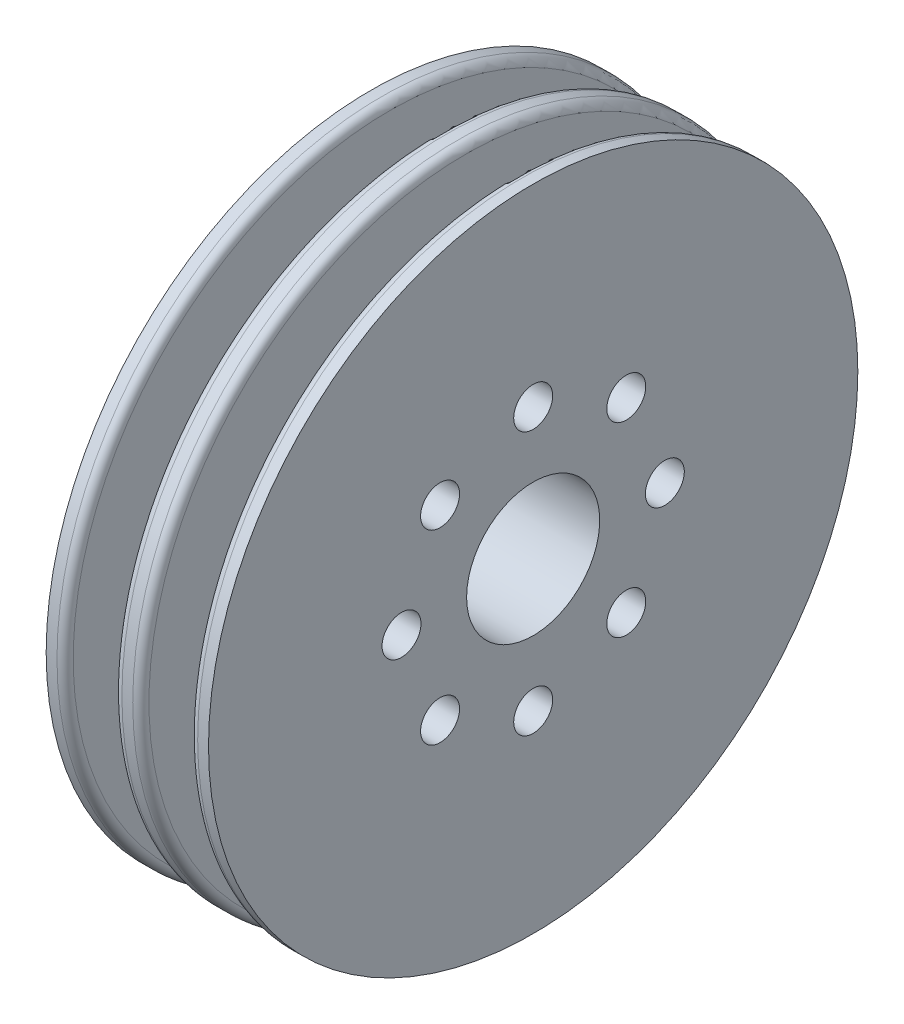
ISO-10303-21;
HEADER;
FILE_DESCRIPTION(('STEP AP214'),'2;1');
FILE_NAME('part.step','',(''),(''),'','','');
FILE_SCHEMA(('AUTOMOTIVE_DESIGN { 1 0 10303 214 1 1 1 1 }'));
ENDSEC;
DATA;
#1=APPLICATION_CONTEXT('core data for automotive mechanical design processes');
#2=APPLICATION_PROTOCOL_DEFINITION('international standard','automotive_design',2000,#1);
#3=PRODUCT_CONTEXT('',#1,'mechanical');
#4=PRODUCT('Part','Part','',(#3));
#5=PRODUCT_RELATED_PRODUCT_CATEGORY('part','',(#4));
#6=PRODUCT_DEFINITION_FORMATION('','',#4);
#7=PRODUCT_DEFINITION_CONTEXT('part definition',#1,'design');
#8=PRODUCT_DEFINITION('design','',#6,#7);
#9=PRODUCT_DEFINITION_SHAPE('','',#8);
#10=(LENGTH_UNIT() NAMED_UNIT(*) SI_UNIT(.MILLI.,.METRE.));
#11=(NAMED_UNIT(*) PLANE_ANGLE_UNIT() SI_UNIT($,.RADIAN.));
#12=(NAMED_UNIT(*) SI_UNIT($,.STERADIAN.) SOLID_ANGLE_UNIT());
#13=UNCERTAINTY_MEASURE_WITH_UNIT(LENGTH_MEASURE(1.E-05),#10,'distance_accuracy_value','');
#14=(GEOMETRIC_REPRESENTATION_CONTEXT(3) GLOBAL_UNCERTAINTY_ASSIGNED_CONTEXT((#13)) GLOBAL_UNIT_ASSIGNED_CONTEXT((#10,
#11,#12)) REPRESENTATION_CONTEXT('',''));
#15=CARTESIAN_POINT('',(0.,0.,0.));
#16=DIRECTION('',(0.,0.,1.));
#17=DIRECTION('',(1.,0.,0.));
#18=AXIS2_PLACEMENT_3D('',#15,#16,#17);
#19=CARTESIAN_POINT('',(0.,0.,20.));
#20=DIRECTION('',(1.,0.,0.));
#21=DIRECTION('',(0.,0.,-1.));
#22=AXIS2_PLACEMENT_3D('',#19,#20,#21);
#23=PLANE('',#22);
#24=CARTESIAN_POINT('',(0.,0.,0.));
#25=DIRECTION('',(-1.,0.,0.));
#26=DIRECTION('',(0.,0.,1.));
#27=AXIS2_PLACEMENT_3D('',#24,#25,#26);
#28=CIRCLE('',#27,4.1);
#29=CARTESIAN_POINT('',(0.,0.,4.1));
#30=VERTEX_POINT('',#29);
#31=EDGE_CURVE('E238',#30,#30,#28,.T.);
#32=ORIENTED_EDGE('',*,*,#31,.F.);
#33=EDGE_LOOP('',(#32));
#34=FACE_BOUND('',#33,.T.);
#35=CARTESIAN_POINT('',(0.,0.,8.11));
#36=DIRECTION('',(-1.,0.,0.));
#37=DIRECTION('',(0.,0.,1.));
#38=AXIS2_PLACEMENT_3D('',#35,#36,#37);
#39=CIRCLE('',#38,2.19999999999999);
#40=CARTESIAN_POINT('',(0.,0.,10.31));
#41=VERTEX_POINT('',#40);
#42=EDGE_CURVE('E233',#41,#41,#39,.T.);
#43=ORIENTED_EDGE('',*,*,#42,.F.);
#44=EDGE_LOOP('',(#43));
#45=FACE_BOUND('',#44,.T.);
#46=CARTESIAN_POINT('',(0.,5.73463599542283,5.73463599542297));
#47=DIRECTION('',(-1.,0.,0.));
#48=DIRECTION('',(0.,0.,1.));
#49=AXIS2_PLACEMENT_3D('',#46,#47,#48);
#50=CIRCLE('',#49,2.19999999999999);
#51=CARTESIAN_POINT('',(0.,5.73463599542283,7.93463599542297));
#52=VERTEX_POINT('',#51);
#53=EDGE_CURVE('E217',#52,#52,#50,.T.);
#54=ORIENTED_EDGE('',*,*,#53,.F.);
#55=EDGE_LOOP('',(#54));
#56=FACE_BOUND('',#55,.T.);
#57=CARTESIAN_POINT('',(0.,8.11,0.));
#58=DIRECTION('',(-1.,0.,0.));
#59=DIRECTION('',(0.,0.,1.));
#60=AXIS2_PLACEMENT_3D('',#57,#58,#59);
#61=CIRCLE('',#60,2.19999999999999);
#62=CARTESIAN_POINT('',(0.,8.11,2.20000000000008));
#63=VERTEX_POINT('',#62);
#64=EDGE_CURVE('E201',#63,#63,#61,.T.);
#65=ORIENTED_EDGE('',*,*,#64,.F.);
#66=EDGE_LOOP('',(#65));
#67=FACE_BOUND('',#66,.T.);
#68=CARTESIAN_POINT('',(0.,5.73463599542295,-5.73463599542285));
#69=DIRECTION('',(-1.,0.,0.));
#70=DIRECTION('',(0.,0.,1.));
#71=AXIS2_PLACEMENT_3D('',#68,#69,#70);
#72=CIRCLE('',#71,2.19999999999999);
#73=CARTESIAN_POINT('',(0.,5.73463599542295,-3.53463599542286));
#74=VERTEX_POINT('',#73);
#75=EDGE_CURVE('E185',#74,#74,#72,.T.);
#76=ORIENTED_EDGE('',*,*,#75,.F.);
#77=EDGE_LOOP('',(#76));
#78=FACE_BOUND('',#77,.T.);
#79=CARTESIAN_POINT('',(0.,0.,-8.11));
#80=DIRECTION('',(-1.,0.,0.));
#81=DIRECTION('',(0.,0.,1.));
#82=AXIS2_PLACEMENT_3D('',#79,#80,#81);
#83=CIRCLE('',#82,2.19999999999999);
#84=CARTESIAN_POINT('',(0.,0.,-5.91000000000001));
#85=VERTEX_POINT('',#84);
#86=EDGE_CURVE('E169',#85,#85,#83,.T.);
#87=ORIENTED_EDGE('',*,*,#86,.F.);
#88=EDGE_LOOP('',(#87));
#89=FACE_BOUND('',#88,.T.);
#90=CARTESIAN_POINT('',(0.,-5.73463599542287,-5.73463599542293));
#91=DIRECTION('',(-1.,0.,0.));
#92=DIRECTION('',(0.,0.,1.));
#93=AXIS2_PLACEMENT_3D('',#90,#91,#92);
#94=CIRCLE('',#93,2.19999999999999);
#95=CARTESIAN_POINT('',(0.,-5.73463599542287,-3.53463599542294));
#96=VERTEX_POINT('',#95);
#97=EDGE_CURVE('E153',#96,#96,#94,.T.);
#98=ORIENTED_EDGE('',*,*,#97,.F.);
#99=EDGE_LOOP('',(#98));
#100=FACE_BOUND('',#99,.T.);
#101=CARTESIAN_POINT('',(0.,-5.73463599542291,5.73463599542289));
#102=DIRECTION('',(-1.,0.,0.));
#103=DIRECTION('',(0.,0.,1.));
#104=AXIS2_PLACEMENT_3D('',#101,#102,#103);
#105=CIRCLE('',#104,2.19999999999999);
#106=CARTESIAN_POINT('',(0.,-5.73463599542291,7.93463599542289));
#107=VERTEX_POINT('',#106);
#108=EDGE_CURVE('E121',#107,#107,#105,.T.);
#109=ORIENTED_EDGE('',*,*,#108,.F.);
#110=EDGE_LOOP('',(#109));
#111=FACE_BOUND('',#110,.T.);
#112=CARTESIAN_POINT('',(0.,0.,0.));
#113=DIRECTION('',(1.,0.,0.));
#114=DIRECTION('',(0.,0.,-1.));
#115=AXIS2_PLACEMENT_3D('',#112,#113,#114);
#116=CIRCLE('',#115,20.);
#117=CARTESIAN_POINT('',(0.,0.,-20.));
#118=VERTEX_POINT('',#117);
#119=EDGE_CURVE('E89',#118,#118,#116,.T.);
#120=ORIENTED_EDGE('',*,*,#119,.F.);
#121=EDGE_LOOP('',(#120));
#122=FACE_BOUND('',#121,.T.);
#123=CARTESIAN_POINT('',(0.,-8.11,0.));
#124=DIRECTION('',(-1.,0.,0.));
#125=DIRECTION('',(0.,0.,1.));
#126=AXIS2_PLACEMENT_3D('',#123,#124,#125);
#127=CIRCLE('',#126,2.19999999999999);
#128=CARTESIAN_POINT('',(0.,-8.11,2.19999999999996));
#129=VERTEX_POINT('',#128);
#130=EDGE_CURVE('E137',#129,#129,#127,.T.);
#131=ORIENTED_EDGE('',*,*,#130,.F.);
#132=EDGE_LOOP('',(#131));
#133=FACE_BOUND('',#132,.T.);
#134=ADVANCED_FACE('F45',(#34,#45,#56,#67,#78,#89,#100,#111,#122,#133),#23,.F.);
#135=CARTESIAN_POINT('',(7.33333333333333,0.,0.));
#136=DIRECTION('',(1.,0.,0.));
#137=DIRECTION('',(0.,0.,-1.));
#138=AXIS2_PLACEMENT_3D('',#135,#136,#137);
#139=TOROIDAL_SURFACE('',#138,15.,1.5);
#140=CARTESIAN_POINT('',(8.83333333333333,0.,0.));
#141=DIRECTION('',(1.,0.,0.));
#142=DIRECTION('',(0.,0.,-1.));
#143=AXIS2_PLACEMENT_3D('',#140,#141,#142);
#144=CIRCLE('',#143,15.);
#145=CARTESIAN_POINT('',(8.83333333333333,0.,-15.));
#146=VERTEX_POINT('',#145);
#147=EDGE_CURVE('E105',#146,#146,#144,.T.);
#148=ORIENTED_EDGE('',*,*,#147,.F.);
#149=EDGE_LOOP('',(#148));
#150=FACE_BOUND('',#149,.T.);
#151=CARTESIAN_POINT('',(5.83333333333333,0.,0.));
#152=DIRECTION('',(1.,0.,0.));
#153=DIRECTION('',(0.,0.,-1.));
#154=AXIS2_PLACEMENT_3D('',#151,#152,#153);
#155=CIRCLE('',#154,15.);
#156=CARTESIAN_POINT('',(5.83333333333333,0.,-15.));
#157=VERTEX_POINT('',#156);
#158=EDGE_CURVE('E10',#157,#157,#155,.T.);
#159=ORIENTED_EDGE('',*,*,#158,.T.);
#160=EDGE_LOOP('',(#159));
#161=FACE_BOUND('',#160,.T.);
#162=ADVANCED_FACE('F47',(#150,#161),#139,.F.);
#163=CARTESIAN_POINT('',(5.83333333333333,0.,19.5));
#164=DIRECTION('',(-1.,0.,0.));
#165=DIRECTION('',(0.,0.,1.));
#166=AXIS2_PLACEMENT_3D('',#163,#164,#165);
#167=PLANE('',#166);
#168=ORIENTED_EDGE('',*,*,#158,.F.);
#169=EDGE_LOOP('',(#168));
#170=FACE_BOUND('',#169,.T.);
#171=CARTESIAN_POINT('',(5.83333333333333,0.,0.));
#172=DIRECTION('',(1.,0.,0.));
#173=DIRECTION('',(0.,0.,-1.));
#174=AXIS2_PLACEMENT_3D('',#171,#172,#173);
#175=CIRCLE('',#174,19.5);
#176=CARTESIAN_POINT('',(5.83333333333333,0.,-19.5));
#177=VERTEX_POINT('',#176);
#178=EDGE_CURVE('E53',#177,#177,#175,.T.);
#179=ORIENTED_EDGE('',*,*,#178,.T.);
#180=EDGE_LOOP('',(#179));
#181=FACE_BOUND('',#180,.T.);
#182=ADVANCED_FACE('F355',(#170,#181),#167,.F.);
#183=CARTESIAN_POINT('',(5.33333333333333,0.,0.));
#184=DIRECTION('',(1.,0.,0.));
#185=DIRECTION('',(0.,0.,-1.));
#186=AXIS2_PLACEMENT_3D('',#183,#184,#185);
#187=TOROIDAL_SURFACE('',#186,19.5,0.5);
#188=ORIENTED_EDGE('',*,*,#178,.F.);
#189=EDGE_LOOP('',(#188));
#190=FACE_BOUND('',#189,.T.);
#191=CARTESIAN_POINT('',(5.33333333333333,0.,0.));
#192=DIRECTION('',(1.,0.,0.));
#193=DIRECTION('',(0.,0.,-1.));
#194=AXIS2_PLACEMENT_3D('',#191,#192,#193);
#195=CIRCLE('',#194,20.);
#196=CARTESIAN_POINT('',(5.33333333333333,0.,-20.));
#197=VERTEX_POINT('',#196);
#198=EDGE_CURVE('E58',#197,#197,#195,.T.);
#199=ORIENTED_EDGE('',*,*,#198,.T.);
#200=EDGE_LOOP('',(#199));
#201=FACE_BOUND('',#200,.T.);
#202=ADVANCED_FACE('F352',(#190,#201),#187,.T.);
#203=CARTESIAN_POINT('',(10.,0.,0.));
#204=DIRECTION('',(1.,0.,0.));
#205=DIRECTION('',(0.,0.,-1.));
#206=AXIS2_PLACEMENT_3D('',#203,#204,#205);
#207=CYLINDRICAL_SURFACE('',#206,20.);
#208=ORIENTED_EDGE('',*,*,#198,.F.);
#209=EDGE_LOOP('',(#208));
#210=FACE_BOUND('',#209,.T.);
#211=CARTESIAN_POINT('',(4.66666666666667,0.,0.));
#212=DIRECTION('',(1.,0.,0.));
#213=DIRECTION('',(0.,0.,-1.));
#214=AXIS2_PLACEMENT_3D('',#211,#212,#213);
#215=CIRCLE('',#214,20.);
#216=CARTESIAN_POINT('',(4.66666666666667,0.,-20.));
#217=VERTEX_POINT('',#216);
#218=EDGE_CURVE('E63',#217,#217,#215,.T.);
#219=ORIENTED_EDGE('',*,*,#218,.T.);
#220=EDGE_LOOP('',(#219));
#221=FACE_BOUND('',#220,.T.);
#222=ADVANCED_FACE('F348',(#210,#221),#207,.T.);
#223=CARTESIAN_POINT('',(4.66666666666667,0.,0.));
#224=DIRECTION('',(1.,0.,0.));
#225=DIRECTION('',(0.,0.,-1.));
#226=AXIS2_PLACEMENT_3D('',#223,#224,#225);
#227=TOROIDAL_SURFACE('',#226,19.5,0.5);
#228=ORIENTED_EDGE('',*,*,#218,.F.);
#229=EDGE_LOOP('',(#228));
#230=FACE_BOUND('',#229,.T.);
#231=CARTESIAN_POINT('',(4.16666666666667,0.,0.));
#232=DIRECTION('',(1.,0.,0.));
#233=DIRECTION('',(0.,0.,-1.));
#234=AXIS2_PLACEMENT_3D('',#231,#232,#233);
#235=CIRCLE('',#234,19.5);
#236=CARTESIAN_POINT('',(4.16666666666667,0.,-19.5));
#237=VERTEX_POINT('',#236);
#238=EDGE_CURVE('E69',#237,#237,#235,.T.);
#239=ORIENTED_EDGE('',*,*,#238,.T.);
#240=EDGE_LOOP('',(#239));
#241=FACE_BOUND('',#240,.T.);
#242=ADVANCED_FACE('F344',(#230,#241),#227,.T.);
#243=CARTESIAN_POINT('',(4.16666666666667,0.,19.5));
#244=DIRECTION('',(1.,0.,0.));
#245=DIRECTION('',(0.,0.,-1.));
#246=AXIS2_PLACEMENT_3D('',#243,#244,#245);
#247=PLANE('',#246);
#248=ORIENTED_EDGE('',*,*,#238,.F.);
#249=EDGE_LOOP('',(#248));
#250=FACE_BOUND('',#249,.T.);
#251=CARTESIAN_POINT('',(4.16666666666667,0.,0.));
#252=DIRECTION('',(1.,0.,0.));
#253=DIRECTION('',(0.,0.,-1.));
#254=AXIS2_PLACEMENT_3D('',#251,#252,#253);
#255=CIRCLE('',#254,15.);
#256=CARTESIAN_POINT('',(4.16666666666667,0.,-15.));
#257=VERTEX_POINT('',#256);
#258=EDGE_CURVE('E73',#257,#257,#255,.T.);
#259=ORIENTED_EDGE('',*,*,#258,.T.);
#260=EDGE_LOOP('',(#259));
#261=FACE_BOUND('',#260,.T.);
#262=ADVANCED_FACE('F340',(#250,#261),#247,.F.);
#263=CARTESIAN_POINT('',(2.66666666666667,0.,0.));
#264=DIRECTION('',(1.,0.,0.));
#265=DIRECTION('',(0.,0.,-1.));
#266=AXIS2_PLACEMENT_3D('',#263,#264,#265);
#267=TOROIDAL_SURFACE('',#266,15.,1.5);
#268=ORIENTED_EDGE('',*,*,#258,.F.);
#269=EDGE_LOOP('',(#268));
#270=FACE_BOUND('',#269,.T.);
#271=CARTESIAN_POINT('',(1.16666666666667,0.,0.));
#272=DIRECTION('',(1.,0.,0.));
#273=DIRECTION('',(0.,0.,-1.));
#274=AXIS2_PLACEMENT_3D('',#271,#272,#273);
#275=CIRCLE('',#274,15.);
#276=CARTESIAN_POINT('',(1.16666666666667,0.,-15.));
#277=VERTEX_POINT('',#276);
#278=EDGE_CURVE('E77',#277,#277,#275,.T.);
#279=ORIENTED_EDGE('',*,*,#278,.T.);
#280=EDGE_LOOP('',(#279));
#281=FACE_BOUND('',#280,.T.);
#282=ADVANCED_FACE('F336',(#270,#281),#267,.F.);
#283=CARTESIAN_POINT('',(1.16666666666667,0.,15.));
#284=DIRECTION('',(-1.,0.,0.));
#285=DIRECTION('',(0.,0.,1.));
#286=AXIS2_PLACEMENT_3D('',#283,#284,#285);
#287=PLANE('',#286);
#288=ORIENTED_EDGE('',*,*,#278,.F.);
#289=EDGE_LOOP('',(#288));
#290=FACE_BOUND('',#289,.T.);
#291=CARTESIAN_POINT('',(1.16666666666667,0.,0.));
#292=DIRECTION('',(1.,0.,0.));
#293=DIRECTION('',(0.,0.,-1.));
#294=AXIS2_PLACEMENT_3D('',#291,#292,#293);
#295=CIRCLE('',#294,19.5);
#296=CARTESIAN_POINT('',(1.16666666666667,0.,-19.5));
#297=VERTEX_POINT('',#296);
#298=EDGE_CURVE('E81',#297,#297,#295,.T.);
#299=ORIENTED_EDGE('',*,*,#298,.T.);
#300=EDGE_LOOP('',(#299));
#301=FACE_BOUND('',#300,.T.);
#302=ADVANCED_FACE('F332',(#290,#301),#287,.F.);
#303=CARTESIAN_POINT('',(0.666666666666666,0.,0.));
#304=DIRECTION('',(1.,0.,0.));
#305=DIRECTION('',(0.,0.,-1.));
#306=AXIS2_PLACEMENT_3D('',#303,#304,#305);
#307=TOROIDAL_SURFACE('',#306,19.5,0.5);
#308=ORIENTED_EDGE('',*,*,#298,.F.);
#309=EDGE_LOOP('',(#308));
#310=FACE_BOUND('',#309,.T.);
#311=CARTESIAN_POINT('',(0.666666666666666,0.,0.));
#312=DIRECTION('',(1.,0.,0.));
#313=DIRECTION('',(0.,0.,-1.));
#314=AXIS2_PLACEMENT_3D('',#311,#312,#313);
#315=CIRCLE('',#314,20.);
#316=CARTESIAN_POINT('',(0.666666666666666,0.,-20.));
#317=VERTEX_POINT('',#316);
#318=EDGE_CURVE('E85',#317,#317,#315,.T.);
#319=ORIENTED_EDGE('',*,*,#318,.T.);
#320=EDGE_LOOP('',(#319));
#321=FACE_BOUND('',#320,.T.);
#322=ADVANCED_FACE('F328',(#310,#321),#307,.T.);
#323=CARTESIAN_POINT('',(10.,0.,0.));
#324=DIRECTION('',(1.,0.,0.));
#325=DIRECTION('',(0.,0.,-1.));
#326=AXIS2_PLACEMENT_3D('',#323,#324,#325);
#327=CYLINDRICAL_SURFACE('',#326,20.);
#328=ORIENTED_EDGE('',*,*,#318,.F.);
#329=EDGE_LOOP('',(#328));
#330=FACE_BOUND('',#329,.T.);
#331=ORIENTED_EDGE('',*,*,#119,.T.);
#332=EDGE_LOOP('',(#331));
#333=FACE_BOUND('',#332,.T.);
#334=ADVANCED_FACE('F324',(#330,#333),#327,.T.);
#335=CARTESIAN_POINT('',(10.,0.,20.));
#336=DIRECTION('',(-1.,0.,0.));
#337=DIRECTION('',(0.,0.,1.));
#338=AXIS2_PLACEMENT_3D('',#335,#336,#337);
#339=PLANE('',#338);
#340=CARTESIAN_POINT('',(10.,0.,0.));
#341=DIRECTION('',(-1.,0.,0.));
#342=DIRECTION('',(0.,0.,1.));
#343=AXIS2_PLACEMENT_3D('',#340,#341,#342);
#344=CIRCLE('',#343,4.1);
#345=CARTESIAN_POINT('',(10.,0.,4.1));
#346=VERTEX_POINT('',#345);
#347=EDGE_CURVE('E237',#346,#346,#344,.T.);
#348=ORIENTED_EDGE('',*,*,#347,.T.);
#349=EDGE_LOOP('',(#348));
#350=FACE_BOUND('',#349,.T.);
#351=CARTESIAN_POINT('',(10.,0.,8.11));
#352=DIRECTION('',(-1.,0.,0.));
#353=DIRECTION('',(0.,0.,1.));
#354=AXIS2_PLACEMENT_3D('',#351,#352,#353);
#355=CIRCLE('',#354,1.2);
#356=CARTESIAN_POINT('',(10.,0.,9.31));
#357=VERTEX_POINT('',#356);
#358=EDGE_CURVE('E221',#357,#357,#355,.T.);
#359=ORIENTED_EDGE('',*,*,#358,.T.);
#360=EDGE_LOOP('',(#359));
#361=FACE_BOUND('',#360,.T.);
#362=CARTESIAN_POINT('',(10.,5.73463599542283,5.73463599542297));
#363=DIRECTION('',(-1.,0.,0.));
#364=DIRECTION('',(0.,0.,1.));
#365=AXIS2_PLACEMENT_3D('',#362,#363,#364);
#366=CIRCLE('',#365,1.2);
#367=CARTESIAN_POINT('',(10.,5.73463599542283,6.93463599542297));
#368=VERTEX_POINT('',#367);
#369=EDGE_CURVE('E205',#368,#368,#366,.T.);
#370=ORIENTED_EDGE('',*,*,#369,.T.);
#371=EDGE_LOOP('',(#370));
#372=FACE_BOUND('',#371,.T.);
#373=CARTESIAN_POINT('',(10.,8.11,0.));
#374=DIRECTION('',(-1.,0.,0.));
#375=DIRECTION('',(0.,0.,1.));
#376=AXIS2_PLACEMENT_3D('',#373,#374,#375);
#377=CIRCLE('',#376,1.2);
#378=CARTESIAN_POINT('',(10.,8.11,1.20000000000008));
#379=VERTEX_POINT('',#378);
#380=EDGE_CURVE('E189',#379,#379,#377,.T.);
#381=ORIENTED_EDGE('',*,*,#380,.T.);
#382=EDGE_LOOP('',(#381));
#383=FACE_BOUND('',#382,.T.);
#384=CARTESIAN_POINT('',(10.,5.73463599542295,-5.73463599542285));
#385=DIRECTION('',(-1.,0.,0.));
#386=DIRECTION('',(0.,0.,1.));
#387=AXIS2_PLACEMENT_3D('',#384,#385,#386);
#388=CIRCLE('',#387,1.2);
#389=CARTESIAN_POINT('',(10.,5.73463599542295,-4.53463599542285));
#390=VERTEX_POINT('',#389);
#391=EDGE_CURVE('E173',#390,#390,#388,.T.);
#392=ORIENTED_EDGE('',*,*,#391,.T.);
#393=EDGE_LOOP('',(#392));
#394=FACE_BOUND('',#393,.T.);
#395=CARTESIAN_POINT('',(10.,0.,-8.11));
#396=DIRECTION('',(-1.,0.,0.));
#397=DIRECTION('',(0.,0.,1.));
#398=AXIS2_PLACEMENT_3D('',#395,#396,#397);
#399=CIRCLE('',#398,1.2);
#400=CARTESIAN_POINT('',(10.,0.,-6.91000000000001));
#401=VERTEX_POINT('',#400);
#402=EDGE_CURVE('E157',#401,#401,#399,.T.);
#403=ORIENTED_EDGE('',*,*,#402,.T.);
#404=EDGE_LOOP('',(#403));
#405=FACE_BOUND('',#404,.T.);
#406=CARTESIAN_POINT('',(10.,-5.73463599542287,-5.73463599542293));
#407=DIRECTION('',(-1.,0.,0.));
#408=DIRECTION('',(0.,0.,1.));
#409=AXIS2_PLACEMENT_3D('',#406,#407,#408);
#410=CIRCLE('',#409,1.2);
#411=CARTESIAN_POINT('',(10.,-5.73463599542287,-4.53463599542293));
#412=VERTEX_POINT('',#411);
#413=EDGE_CURVE('E141',#412,#412,#410,.T.);
#414=ORIENTED_EDGE('',*,*,#413,.T.);
#415=EDGE_LOOP('',(#414));
#416=FACE_BOUND('',#415,.T.);
#417=CARTESIAN_POINT('',(10.,-8.11,0.));
#418=DIRECTION('',(-1.,0.,0.));
#419=DIRECTION('',(0.,0.,1.));
#420=AXIS2_PLACEMENT_3D('',#417,#418,#419);
#421=CIRCLE('',#420,1.2);
#422=CARTESIAN_POINT('',(10.,-8.11,1.19999999999997));
#423=VERTEX_POINT('',#422);
#424=EDGE_CURVE('E125',#423,#423,#421,.T.);
#425=ORIENTED_EDGE('',*,*,#424,.T.);
#426=EDGE_LOOP('',(#425));
#427=FACE_BOUND('',#426,.T.);
#428=CARTESIAN_POINT('',(10.,-5.73463599542291,5.73463599542289));
#429=DIRECTION('',(-1.,0.,0.));
#430=DIRECTION('',(0.,0.,1.));
#431=AXIS2_PLACEMENT_3D('',#428,#429,#430);
#432=CIRCLE('',#431,1.2);
#433=CARTESIAN_POINT('',(10.,-5.73463599542291,6.93463599542289));
#434=VERTEX_POINT('',#433);
#435=EDGE_CURVE('E109',#434,#434,#432,.T.);
#436=ORIENTED_EDGE('',*,*,#435,.T.);
#437=EDGE_LOOP('',(#436));
#438=FACE_BOUND('',#437,.T.);
#439=CARTESIAN_POINT('',(10.,0.,0.));
#440=DIRECTION('',(1.,0.,0.));
#441=DIRECTION('',(0.,0.,-1.));
#442=AXIS2_PLACEMENT_3D('',#439,#440,#441);
#443=CIRCLE('',#442,20.);
#444=CARTESIAN_POINT('',(10.,0.,-20.));
#445=VERTEX_POINT('',#444);
#446=EDGE_CURVE('E93',#445,#445,#443,.T.);
#447=ORIENTED_EDGE('',*,*,#446,.T.);
#448=EDGE_LOOP('',(#447));
#449=FACE_BOUND('',#448,.T.);
#450=ADVANCED_FACE('F246',(#350,#361,#372,#383,#394,#405,#416,#427,#438,#449),#339,.F.);
#451=CARTESIAN_POINT('',(10.,0.,0.));
#452=DIRECTION('',(1.,0.,0.));
#453=DIRECTION('',(0.,0.,-1.));
#454=AXIS2_PLACEMENT_3D('',#451,#452,#453);
#455=CYLINDRICAL_SURFACE('',#454,20.);
#456=ORIENTED_EDGE('',*,*,#446,.F.);
#457=EDGE_LOOP('',(#456));
#458=FACE_BOUND('',#457,.T.);
#459=CARTESIAN_POINT('',(9.33333333333333,0.,0.));
#460=DIRECTION('',(1.,0.,0.));
#461=DIRECTION('',(0.,0.,-1.));
#462=AXIS2_PLACEMENT_3D('',#459,#460,#461);
#463=CIRCLE('',#462,20.);
#464=CARTESIAN_POINT('',(9.33333333333333,0.,-20.));
#465=VERTEX_POINT('',#464);
#466=EDGE_CURVE('E97',#465,#465,#463,.T.);
#467=ORIENTED_EDGE('',*,*,#466,.T.);
#468=EDGE_LOOP('',(#467));
#469=FACE_BOUND('',#468,.T.);
#470=ADVANCED_FACE('F318',(#458,#469),#455,.T.);
#471=CARTESIAN_POINT('',(9.33333333333333,0.,0.));
#472=DIRECTION('',(1.,0.,0.));
#473=DIRECTION('',(0.,0.,-1.));
#474=AXIS2_PLACEMENT_3D('',#471,#472,#473);
#475=TOROIDAL_SURFACE('',#474,19.5,0.5);
#476=ORIENTED_EDGE('',*,*,#466,.F.);
#477=EDGE_LOOP('',(#476));
#478=FACE_BOUND('',#477,.T.);
#479=CARTESIAN_POINT('',(8.83333333333333,0.,0.));
#480=DIRECTION('',(1.,0.,0.));
#481=DIRECTION('',(0.,0.,-1.));
#482=AXIS2_PLACEMENT_3D('',#479,#480,#481);
#483=CIRCLE('',#482,19.5);
#484=CARTESIAN_POINT('',(8.83333333333333,0.,-19.5));
#485=VERTEX_POINT('',#484);
#486=EDGE_CURVE('E101',#485,#485,#483,.T.);
#487=ORIENTED_EDGE('',*,*,#486,.T.);
#488=EDGE_LOOP('',(#487));
#489=FACE_BOUND('',#488,.T.);
#490=ADVANCED_FACE('F314',(#478,#489),#475,.T.);
#491=CARTESIAN_POINT('',(8.83333333333333,0.,15.));
#492=DIRECTION('',(1.,0.,0.));
#493=DIRECTION('',(0.,0.,-1.));
#494=AXIS2_PLACEMENT_3D('',#491,#492,#493);
#495=PLANE('',#494);
#496=ORIENTED_EDGE('',*,*,#486,.F.);
#497=EDGE_LOOP('',(#496));
#498=FACE_BOUND('',#497,.T.);
#499=ORIENTED_EDGE('',*,*,#147,.T.);
#500=EDGE_LOOP('',(#499));
#501=FACE_BOUND('',#500,.T.);
#502=ADVANCED_FACE('F310',(#498,#501),#495,.F.);
#503=CARTESIAN_POINT('',(0.,-5.73463599542291,5.73463599542289));
#504=DIRECTION('',(-1.,0.,0.));
#505=DIRECTION('',(0.,0.,1.));
#506=AXIS2_PLACEMENT_3D('',#503,#504,#505);
#507=CYLINDRICAL_SURFACE('',#506,1.2);
#508=ORIENTED_EDGE('',*,*,#435,.F.);
#509=EDGE_LOOP('',(#508));
#510=FACE_BOUND('',#509,.T.);
#511=CARTESIAN_POINT('',(2.4,-5.73463599542291,5.73463599542289));
#512=DIRECTION('',(-1.,0.,0.));
#513=DIRECTION('',(0.,0.,1.));
#514=AXIS2_PLACEMENT_3D('',#511,#512,#513);
#515=CIRCLE('',#514,1.2);
#516=CARTESIAN_POINT('',(2.4,-5.73463599542291,6.93463599542289));
#517=VERTEX_POINT('',#516);
#518=EDGE_CURVE('E113',#517,#517,#515,.T.);
#519=ORIENTED_EDGE('',*,*,#518,.T.);
#520=EDGE_LOOP('',(#519));
#521=FACE_BOUND('',#520,.T.);
#522=ADVANCED_FACE('F306',(#510,#521),#507,.F.);
#523=CARTESIAN_POINT('',(2.4,-4.53463599542291,5.73463599542289));
#524=DIRECTION('',(1.,0.,0.));
#525=DIRECTION('',(0.,0.,-1.));
#526=AXIS2_PLACEMENT_3D('',#523,#524,#525);
#527=PLANE('',#526);
#528=ORIENTED_EDGE('',*,*,#518,.F.);
#529=EDGE_LOOP('',(#528));
#530=FACE_BOUND('',#529,.T.);
#531=CARTESIAN_POINT('',(2.4,-5.73463599542291,5.73463599542289));
#532=DIRECTION('',(-1.,0.,0.));
#533=DIRECTION('',(0.,0.,1.));
#534=AXIS2_PLACEMENT_3D('',#531,#532,#533);
#535=CIRCLE('',#534,2.2);
#536=CARTESIAN_POINT('',(2.4,-5.73463599542291,7.93463599542289));
#537=VERTEX_POINT('',#536);
#538=EDGE_CURVE('E117',#537,#537,#535,.T.);
#539=ORIENTED_EDGE('',*,*,#538,.T.);
#540=EDGE_LOOP('',(#539));
#541=FACE_BOUND('',#540,.T.);
#542=ADVANCED_FACE('F302',(#530,#541),#527,.F.);
#543=CARTESIAN_POINT('',(0.,-5.73463599542291,5.73463599542289));
#544=DIRECTION('',(-1.,0.,0.));
#545=DIRECTION('',(0.,0.,1.));
#546=AXIS2_PLACEMENT_3D('',#543,#544,#545);
#547=CYLINDRICAL_SURFACE('',#546,2.2);
#548=ORIENTED_EDGE('',*,*,#538,.F.);
#549=EDGE_LOOP('',(#548));
#550=FACE_BOUND('',#549,.T.);
#551=ORIENTED_EDGE('',*,*,#108,.T.);
#552=EDGE_LOOP('',(#551));
#553=FACE_BOUND('',#552,.T.);
#554=ADVANCED_FACE('F298',(#550,#553),#547,.F.);
#555=CARTESIAN_POINT('',(0.,-8.11,0.));
#556=DIRECTION('',(-1.,0.,0.));
#557=DIRECTION('',(0.,0.,1.));
#558=AXIS2_PLACEMENT_3D('',#555,#556,#557);
#559=CYLINDRICAL_SURFACE('',#558,1.2);
#560=ORIENTED_EDGE('',*,*,#424,.F.);
#561=EDGE_LOOP('',(#560));
#562=FACE_BOUND('',#561,.T.);
#563=CARTESIAN_POINT('',(2.4,-8.11,0.));
#564=DIRECTION('',(-1.,0.,0.));
#565=DIRECTION('',(0.,0.,1.));
#566=AXIS2_PLACEMENT_3D('',#563,#564,#565);
#567=CIRCLE('',#566,1.2);
#568=CARTESIAN_POINT('',(2.4,-8.11,1.19999999999997));
#569=VERTEX_POINT('',#568);
#570=EDGE_CURVE('E129',#569,#569,#567,.T.);
#571=ORIENTED_EDGE('',*,*,#570,.T.);
#572=EDGE_LOOP('',(#571));
#573=FACE_BOUND('',#572,.T.);
#574=ADVANCED_FACE('F290',(#562,#573),#559,.F.);
#575=CARTESIAN_POINT('',(2.4,-6.91,0.));
#576=DIRECTION('',(1.,0.,0.));
#577=DIRECTION('',(0.,0.,-1.));
#578=AXIS2_PLACEMENT_3D('',#575,#576,#577);
#579=PLANE('',#578);
#580=ORIENTED_EDGE('',*,*,#570,.F.);
#581=EDGE_LOOP('',(#580));
#582=FACE_BOUND('',#581,.T.);
#583=CARTESIAN_POINT('',(2.4,-8.11,0.));
#584=DIRECTION('',(-1.,0.,0.));
#585=DIRECTION('',(0.,0.,1.));
#586=AXIS2_PLACEMENT_3D('',#583,#584,#585);
#587=CIRCLE('',#586,2.2);
#588=CARTESIAN_POINT('',(2.4,-8.11,2.19999999999997));
#589=VERTEX_POINT('',#588);
#590=EDGE_CURVE('E133',#589,#589,#587,.T.);
#591=ORIENTED_EDGE('',*,*,#590,.T.);
#592=EDGE_LOOP('',(#591));
#593=FACE_BOUND('',#592,.T.);
#594=ADVANCED_FACE('F280',(#582,#593),#579,.F.);
#595=CARTESIAN_POINT('',(0.,-8.11,0.));
#596=DIRECTION('',(-1.,0.,0.));
#597=DIRECTION('',(0.,0.,1.));
#598=AXIS2_PLACEMENT_3D('',#595,#596,#597);
#599=CYLINDRICAL_SURFACE('',#598,2.2);
#600=ORIENTED_EDGE('',*,*,#590,.F.);
#601=EDGE_LOOP('',(#600));
#602=FACE_BOUND('',#601,.T.);
#603=ORIENTED_EDGE('',*,*,#130,.T.);
#604=EDGE_LOOP('',(#603));
#605=FACE_BOUND('',#604,.T.);
#606=ADVANCED_FACE('F277',(#602,#605),#599,.F.);
#607=CARTESIAN_POINT('',(0.,-5.73463599542287,-5.73463599542293));
#608=DIRECTION('',(-1.,0.,0.));
#609=DIRECTION('',(0.,0.,1.));
#610=AXIS2_PLACEMENT_3D('',#607,#608,#609);
#611=CYLINDRICAL_SURFACE('',#610,1.2);
#612=ORIENTED_EDGE('',*,*,#413,.F.);
#613=EDGE_LOOP('',(#612));
#614=FACE_BOUND('',#613,.T.);
#615=CARTESIAN_POINT('',(2.4,-5.73463599542287,-5.73463599542293));
#616=DIRECTION('',(-1.,0.,0.));
#617=DIRECTION('',(0.,0.,1.));
#618=AXIS2_PLACEMENT_3D('',#615,#616,#617);
#619=CIRCLE('',#618,1.2);
#620=CARTESIAN_POINT('',(2.4,-5.73463599542287,-4.53463599542293));
#621=VERTEX_POINT('',#620);
#622=EDGE_CURVE('E145',#621,#621,#619,.T.);
#623=ORIENTED_EDGE('',*,*,#622,.T.);
#624=EDGE_LOOP('',(#623));
#625=FACE_BOUND('',#624,.T.);
#626=ADVANCED_FACE('F279',(#614,#625),#611,.F.);
#627=CARTESIAN_POINT('',(2.4,-4.53463599542287,-5.73463599542293));
#628=DIRECTION('',(1.,0.,0.));
#629=DIRECTION('',(0.,0.,-1.));
#630=AXIS2_PLACEMENT_3D('',#627,#628,#629);
#631=PLANE('',#630);
#632=ORIENTED_EDGE('',*,*,#622,.F.);
#633=EDGE_LOOP('',(#632));
#634=FACE_BOUND('',#633,.T.);
#635=CARTESIAN_POINT('',(2.4,-5.73463599542287,-5.73463599542293));
#636=DIRECTION('',(-1.,0.,0.));
#637=DIRECTION('',(0.,0.,1.));
#638=AXIS2_PLACEMENT_3D('',#635,#636,#637);
#639=CIRCLE('',#638,2.2);
#640=CARTESIAN_POINT('',(2.4,-5.73463599542287,-3.53463599542293));
#641=VERTEX_POINT('',#640);
#642=EDGE_CURVE('E149',#641,#641,#639,.T.);
#643=ORIENTED_EDGE('',*,*,#642,.T.);
#644=EDGE_LOOP('',(#643));
#645=FACE_BOUND('',#644,.T.);
#646=ADVANCED_FACE('F287',(#634,#645),#631,.F.);
#647=CARTESIAN_POINT('',(0.,-5.73463599542287,-5.73463599542293));
#648=DIRECTION('',(-1.,0.,0.));
#649=DIRECTION('',(0.,0.,1.));
#650=AXIS2_PLACEMENT_3D('',#647,#648,#649);
#651=CYLINDRICAL_SURFACE('',#650,2.2);
#652=ORIENTED_EDGE('',*,*,#642,.F.);
#653=EDGE_LOOP('',(#652));
#654=FACE_BOUND('',#653,.T.);
#655=ORIENTED_EDGE('',*,*,#97,.T.);
#656=EDGE_LOOP('',(#655));
#657=FACE_BOUND('',#656,.T.);
#658=ADVANCED_FACE('F498',(#654,#657),#651,.F.);
#659=CARTESIAN_POINT('',(0.,0.,-8.11));
#660=DIRECTION('',(-1.,0.,0.));
#661=DIRECTION('',(0.,0.,1.));
#662=AXIS2_PLACEMENT_3D('',#659,#660,#661);
#663=CYLINDRICAL_SURFACE('',#662,1.2);
#664=ORIENTED_EDGE('',*,*,#402,.F.);
#665=EDGE_LOOP('',(#664));
#666=FACE_BOUND('',#665,.T.);
#667=CARTESIAN_POINT('',(2.4,0.,-8.11));
#668=DIRECTION('',(-1.,0.,0.));
#669=DIRECTION('',(0.,0.,1.));
#670=AXIS2_PLACEMENT_3D('',#667,#668,#669);
#671=CIRCLE('',#670,1.2);
#672=CARTESIAN_POINT('',(2.4,0.,-6.91));
#673=VERTEX_POINT('',#672);
#674=EDGE_CURVE('E161',#673,#673,#671,.T.);
#675=ORIENTED_EDGE('',*,*,#674,.T.);
#676=EDGE_LOOP('',(#675));
#677=FACE_BOUND('',#676,.T.);
#678=ADVANCED_FACE('F507',(#666,#677),#663,.F.);
#679=CARTESIAN_POINT('',(2.4,1.2,-8.11));
#680=DIRECTION('',(1.,0.,0.));
#681=DIRECTION('',(0.,0.,-1.));
#682=AXIS2_PLACEMENT_3D('',#679,#680,#681);
#683=PLANE('',#682);
#684=ORIENTED_EDGE('',*,*,#674,.F.);
#685=EDGE_LOOP('',(#684));
#686=FACE_BOUND('',#685,.T.);
#687=CARTESIAN_POINT('',(2.4,0.,-8.11));
#688=DIRECTION('',(-1.,0.,0.));
#689=DIRECTION('',(0.,0.,1.));
#690=AXIS2_PLACEMENT_3D('',#687,#688,#689);
#691=CIRCLE('',#690,2.2);
#692=CARTESIAN_POINT('',(2.4,0.,-5.91));
#693=VERTEX_POINT('',#692);
#694=EDGE_CURVE('E165',#693,#693,#691,.T.);
#695=ORIENTED_EDGE('',*,*,#694,.T.);
#696=EDGE_LOOP('',(#695));
#697=FACE_BOUND('',#696,.T.);
#698=ADVANCED_FACE('F517',(#686,#697),#683,.F.);
#699=CARTESIAN_POINT('',(0.,0.,-8.11));
#700=DIRECTION('',(-1.,0.,0.));
#701=DIRECTION('',(0.,0.,1.));
#702=AXIS2_PLACEMENT_3D('',#699,#700,#701);
#703=CYLINDRICAL_SURFACE('',#702,2.2);
#704=ORIENTED_EDGE('',*,*,#694,.F.);
#705=EDGE_LOOP('',(#704));
#706=FACE_BOUND('',#705,.T.);
#707=ORIENTED_EDGE('',*,*,#86,.T.);
#708=EDGE_LOOP('',(#707));
#709=FACE_BOUND('',#708,.T.);
#710=ADVANCED_FACE('F527',(#706,#709),#703,.F.);
#711=CARTESIAN_POINT('',(0.,5.73463599542295,-5.73463599542285));
#712=DIRECTION('',(-1.,0.,0.));
#713=DIRECTION('',(0.,0.,1.));
#714=AXIS2_PLACEMENT_3D('',#711,#712,#713);
#715=CYLINDRICAL_SURFACE('',#714,1.2);
#716=ORIENTED_EDGE('',*,*,#391,.F.);
#717=EDGE_LOOP('',(#716));
#718=FACE_BOUND('',#717,.T.);
#719=CARTESIAN_POINT('',(2.4,5.73463599542295,-5.73463599542285));
#720=DIRECTION('',(-1.,0.,0.));
#721=DIRECTION('',(0.,0.,1.));
#722=AXIS2_PLACEMENT_3D('',#719,#720,#721);
#723=CIRCLE('',#722,1.2);
#724=CARTESIAN_POINT('',(2.4,5.73463599542295,-4.53463599542285));
#725=VERTEX_POINT('',#724);
#726=EDGE_CURVE('E177',#725,#725,#723,.T.);
#727=ORIENTED_EDGE('',*,*,#726,.T.);
#728=EDGE_LOOP('',(#727));
#729=FACE_BOUND('',#728,.T.);
#730=ADVANCED_FACE('F537',(#718,#729),#715,.F.);
#731=CARTESIAN_POINT('',(2.4,6.93463599542295,-5.73463599542285));
#732=DIRECTION('',(1.,0.,0.));
#733=DIRECTION('',(0.,0.,-1.));
#734=AXIS2_PLACEMENT_3D('',#731,#732,#733);
#735=PLANE('',#734);
#736=ORIENTED_EDGE('',*,*,#726,.F.);
#737=EDGE_LOOP('',(#736));
#738=FACE_BOUND('',#737,.T.);
#739=CARTESIAN_POINT('',(2.4,5.73463599542295,-5.73463599542285));
#740=DIRECTION('',(-1.,0.,0.));
#741=DIRECTION('',(0.,0.,1.));
#742=AXIS2_PLACEMENT_3D('',#739,#740,#741);
#743=CIRCLE('',#742,2.2);
#744=CARTESIAN_POINT('',(2.4,5.73463599542295,-3.53463599542285));
#745=VERTEX_POINT('',#744);
#746=EDGE_CURVE('E181',#745,#745,#743,.T.);
#747=ORIENTED_EDGE('',*,*,#746,.T.);
#748=EDGE_LOOP('',(#747));
#749=FACE_BOUND('',#748,.T.);
#750=ADVANCED_FACE('F547',(#738,#749),#735,.F.);
#751=CARTESIAN_POINT('',(0.,5.73463599542295,-5.73463599542285));
#752=DIRECTION('',(-1.,0.,0.));
#753=DIRECTION('',(0.,0.,1.));
#754=AXIS2_PLACEMENT_3D('',#751,#752,#753);
#755=CYLINDRICAL_SURFACE('',#754,2.2);
#756=ORIENTED_EDGE('',*,*,#746,.F.);
#757=EDGE_LOOP('',(#756));
#758=FACE_BOUND('',#757,.T.);
#759=ORIENTED_EDGE('',*,*,#75,.T.);
#760=EDGE_LOOP('',(#759));
#761=FACE_BOUND('',#760,.T.);
#762=ADVANCED_FACE('F557',(#758,#761),#755,.F.);
#763=CARTESIAN_POINT('',(0.,8.11,0.));
#764=DIRECTION('',(-1.,0.,0.));
#765=DIRECTION('',(0.,0.,1.));
#766=AXIS2_PLACEMENT_3D('',#763,#764,#765);
#767=CYLINDRICAL_SURFACE('',#766,1.2);
#768=ORIENTED_EDGE('',*,*,#380,.F.);
#769=EDGE_LOOP('',(#768));
#770=FACE_BOUND('',#769,.T.);
#771=CARTESIAN_POINT('',(2.4,8.11,0.));
#772=DIRECTION('',(-1.,0.,0.));
#773=DIRECTION('',(0.,0.,1.));
#774=AXIS2_PLACEMENT_3D('',#771,#772,#773);
#775=CIRCLE('',#774,1.2);
#776=CARTESIAN_POINT('',(2.4,8.11,1.20000000000009));
#777=VERTEX_POINT('',#776);
#778=EDGE_CURVE('E193',#777,#777,#775,.T.);
#779=ORIENTED_EDGE('',*,*,#778,.T.);
#780=EDGE_LOOP('',(#779));
#781=FACE_BOUND('',#780,.T.);
#782=ADVANCED_FACE('F567',(#770,#781),#767,.F.);
#783=CARTESIAN_POINT('',(2.4,9.31,0.));
#784=DIRECTION('',(1.,0.,0.));
#785=DIRECTION('',(0.,0.,-1.));
#786=AXIS2_PLACEMENT_3D('',#783,#784,#785);
#787=PLANE('',#786);
#788=ORIENTED_EDGE('',*,*,#778,.F.);
#789=EDGE_LOOP('',(#788));
#790=FACE_BOUND('',#789,.T.);
#791=CARTESIAN_POINT('',(2.4,8.11,0.));
#792=DIRECTION('',(-1.,0.,0.));
#793=DIRECTION('',(0.,0.,1.));
#794=AXIS2_PLACEMENT_3D('',#791,#792,#793);
#795=CIRCLE('',#794,2.2);
#796=CARTESIAN_POINT('',(2.4,8.11,2.20000000000008));
#797=VERTEX_POINT('',#796);
#798=EDGE_CURVE('E197',#797,#797,#795,.T.);
#799=ORIENTED_EDGE('',*,*,#798,.T.);
#800=EDGE_LOOP('',(#799));
#801=FACE_BOUND('',#800,.T.);
#802=ADVANCED_FACE('F577',(#790,#801),#787,.F.);
#803=CARTESIAN_POINT('',(0.,8.11,0.));
#804=DIRECTION('',(-1.,0.,0.));
#805=DIRECTION('',(0.,0.,1.));
#806=AXIS2_PLACEMENT_3D('',#803,#804,#805);
#807=CYLINDRICAL_SURFACE('',#806,2.2);
#808=ORIENTED_EDGE('',*,*,#798,.F.);
#809=EDGE_LOOP('',(#808));
#810=FACE_BOUND('',#809,.T.);
#811=ORIENTED_EDGE('',*,*,#64,.T.);
#812=EDGE_LOOP('',(#811));
#813=FACE_BOUND('',#812,.T.);
#814=ADVANCED_FACE('F587',(#810,#813),#807,.F.);
#815=CARTESIAN_POINT('',(0.,5.73463599542283,5.73463599542297));
#816=DIRECTION('',(-1.,0.,0.));
#817=DIRECTION('',(0.,0.,1.));
#818=AXIS2_PLACEMENT_3D('',#815,#816,#817);
#819=CYLINDRICAL_SURFACE('',#818,1.2);
#820=ORIENTED_EDGE('',*,*,#369,.F.);
#821=EDGE_LOOP('',(#820));
#822=FACE_BOUND('',#821,.T.);
#823=CARTESIAN_POINT('',(2.4,5.73463599542283,5.73463599542297));
#824=DIRECTION('',(-1.,0.,0.));
#825=DIRECTION('',(0.,0.,1.));
#826=AXIS2_PLACEMENT_3D('',#823,#824,#825);
#827=CIRCLE('',#826,1.2);
#828=CARTESIAN_POINT('',(2.4,5.73463599542283,6.93463599542297));
#829=VERTEX_POINT('',#828);
#830=EDGE_CURVE('E209',#829,#829,#827,.T.);
#831=ORIENTED_EDGE('',*,*,#830,.T.);
#832=EDGE_LOOP('',(#831));
#833=FACE_BOUND('',#832,.T.);
#834=ADVANCED_FACE('F597',(#822,#833),#819,.F.);
#835=CARTESIAN_POINT('',(2.4,6.93463599542283,5.73463599542297));
#836=DIRECTION('',(1.,0.,0.));
#837=DIRECTION('',(0.,0.,-1.));
#838=AXIS2_PLACEMENT_3D('',#835,#836,#837);
#839=PLANE('',#838);
#840=ORIENTED_EDGE('',*,*,#830,.F.);
#841=EDGE_LOOP('',(#840));
#842=FACE_BOUND('',#841,.T.);
#843=CARTESIAN_POINT('',(2.4,5.73463599542283,5.73463599542297));
#844=DIRECTION('',(-1.,0.,0.));
#845=DIRECTION('',(0.,0.,1.));
#846=AXIS2_PLACEMENT_3D('',#843,#844,#845);
#847=CIRCLE('',#846,2.2);
#848=CARTESIAN_POINT('',(2.4,5.73463599542283,7.93463599542297));
#849=VERTEX_POINT('',#848);
#850=EDGE_CURVE('E213',#849,#849,#847,.T.);
#851=ORIENTED_EDGE('',*,*,#850,.T.);
#852=EDGE_LOOP('',(#851));
#853=FACE_BOUND('',#852,.T.);
#854=ADVANCED_FACE('F607',(#842,#853),#839,.F.);
#855=CARTESIAN_POINT('',(0.,5.73463599542283,5.73463599542297));
#856=DIRECTION('',(-1.,0.,0.));
#857=DIRECTION('',(0.,0.,1.));
#858=AXIS2_PLACEMENT_3D('',#855,#856,#857);
#859=CYLINDRICAL_SURFACE('',#858,2.2);
#860=ORIENTED_EDGE('',*,*,#850,.F.);
#861=EDGE_LOOP('',(#860));
#862=FACE_BOUND('',#861,.T.);
#863=ORIENTED_EDGE('',*,*,#53,.T.);
#864=EDGE_LOOP('',(#863));
#865=FACE_BOUND('',#864,.T.);
#866=ADVANCED_FACE('F617',(#862,#865),#859,.F.);
#867=CARTESIAN_POINT('',(0.,0.,8.11));
#868=DIRECTION('',(-1.,0.,0.));
#869=DIRECTION('',(0.,0.,1.));
#870=AXIS2_PLACEMENT_3D('',#867,#868,#869);
#871=CYLINDRICAL_SURFACE('',#870,1.2);
#872=ORIENTED_EDGE('',*,*,#358,.F.);
#873=EDGE_LOOP('',(#872));
#874=FACE_BOUND('',#873,.T.);
#875=CARTESIAN_POINT('',(2.4,0.,8.11));
#876=DIRECTION('',(-1.,0.,0.));
#877=DIRECTION('',(0.,0.,1.));
#878=AXIS2_PLACEMENT_3D('',#875,#876,#877);
#879=CIRCLE('',#878,1.2);
#880=CARTESIAN_POINT('',(2.4,0.,9.31));
#881=VERTEX_POINT('',#880);
#882=EDGE_CURVE('E225',#881,#881,#879,.T.);
#883=ORIENTED_EDGE('',*,*,#882,.T.);
#884=EDGE_LOOP('',(#883));
#885=FACE_BOUND('',#884,.T.);
#886=ADVANCED_FACE('F627',(#874,#885),#871,.F.);
#887=CARTESIAN_POINT('',(2.4,1.2,8.11));
#888=DIRECTION('',(1.,0.,0.));
#889=DIRECTION('',(0.,0.,-1.));
#890=AXIS2_PLACEMENT_3D('',#887,#888,#889);
#891=PLANE('',#890);
#892=ORIENTED_EDGE('',*,*,#882,.F.);
#893=EDGE_LOOP('',(#892));
#894=FACE_BOUND('',#893,.T.);
#895=CARTESIAN_POINT('',(2.4,0.,8.11));
#896=DIRECTION('',(-1.,0.,0.));
#897=DIRECTION('',(0.,0.,1.));
#898=AXIS2_PLACEMENT_3D('',#895,#896,#897);
#899=CIRCLE('',#898,2.2);
#900=CARTESIAN_POINT('',(2.4,0.,10.31));
#901=VERTEX_POINT('',#900);
#902=EDGE_CURVE('E229',#901,#901,#899,.T.);
#903=ORIENTED_EDGE('',*,*,#902,.T.);
#904=EDGE_LOOP('',(#903));
#905=FACE_BOUND('',#904,.T.);
#906=ADVANCED_FACE('F637',(#894,#905),#891,.F.);
#907=CARTESIAN_POINT('',(0.,0.,8.11));
#908=DIRECTION('',(-1.,0.,0.));
#909=DIRECTION('',(0.,0.,1.));
#910=AXIS2_PLACEMENT_3D('',#907,#908,#909);
#911=CYLINDRICAL_SURFACE('',#910,2.2);
#912=ORIENTED_EDGE('',*,*,#902,.F.);
#913=EDGE_LOOP('',(#912));
#914=FACE_BOUND('',#913,.T.);
#915=ORIENTED_EDGE('',*,*,#42,.T.);
#916=EDGE_LOOP('',(#915));
#917=FACE_BOUND('',#916,.T.);
#918=ADVANCED_FACE('F252',(#914,#917),#911,.F.);
#919=CARTESIAN_POINT('',(10.,0.,0.));
#920=DIRECTION('',(-1.,0.,0.));
#921=DIRECTION('',(0.,0.,1.));
#922=AXIS2_PLACEMENT_3D('',#919,#920,#921);
#923=CYLINDRICAL_SURFACE('',#922,4.1);
#924=ORIENTED_EDGE('',*,*,#347,.F.);
#925=EDGE_LOOP('',(#924));
#926=FACE_BOUND('',#925,.T.);
#927=ORIENTED_EDGE('',*,*,#31,.T.);
#928=EDGE_LOOP('',(#927));
#929=FACE_BOUND('',#928,.T.);
#930=ADVANCED_FACE('F249',(#926,#929),#923,.F.);
#931=CLOSED_SHELL('',(#134,#162,#182,#202,#222,#242,#262,#282,#302,#322,#334,#450,#470,#490,
#502,#522,#542,#554,#574,#594,#606,#626,#646,#658,#678,#698,#710,#730,#750,#762,#782,#802,#814,
#834,#854,#866,#886,#906,#918,#930));
#932=MANIFOLD_SOLID_BREP('B2',#931);
#933=ADVANCED_BREP_SHAPE_REPRESENTATION('',(#18,#932),#14);
#934=SHAPE_DEFINITION_REPRESENTATION(#9,#933);
ENDSEC;
END-ISO-10303-21;
